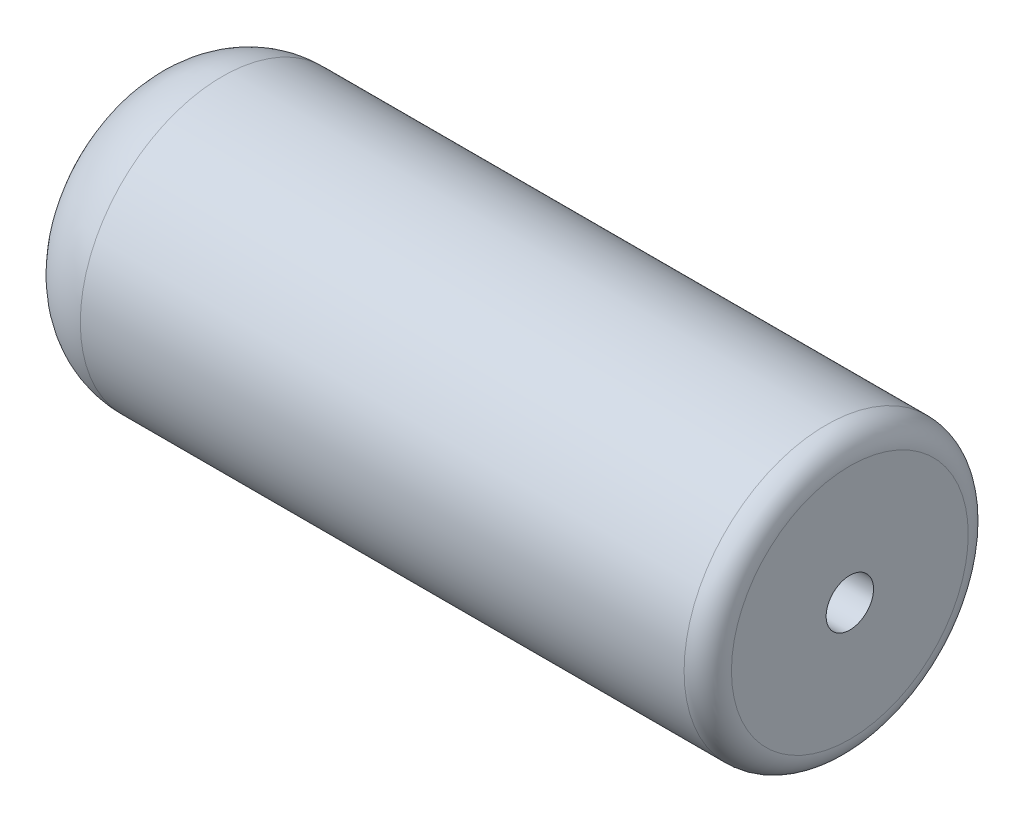
ISO-10303-21;
HEADER;
FILE_DESCRIPTION(('STEP AP214'),'2;1');
FILE_NAME('part.step','',(''),(''),'','','');
FILE_SCHEMA(('AUTOMOTIVE_DESIGN { 1 0 10303 214 1 1 1 1 }'));
ENDSEC;
DATA;
#1=APPLICATION_CONTEXT('core data for automotive mechanical design processes');
#2=APPLICATION_PROTOCOL_DEFINITION('international standard','automotive_design',2000,#1);
#3=PRODUCT_CONTEXT('',#1,'mechanical');
#4=PRODUCT('Part','Part','',(#3));
#5=PRODUCT_RELATED_PRODUCT_CATEGORY('part','',(#4));
#6=PRODUCT_DEFINITION_FORMATION('','',#4);
#7=PRODUCT_DEFINITION_CONTEXT('part definition',#1,'design');
#8=PRODUCT_DEFINITION('design','',#6,#7);
#9=PRODUCT_DEFINITION_SHAPE('','',#8);
#10=(LENGTH_UNIT() NAMED_UNIT(*) SI_UNIT(.MILLI.,.METRE.));
#11=(NAMED_UNIT(*) PLANE_ANGLE_UNIT() SI_UNIT($,.RADIAN.));
#12=(NAMED_UNIT(*) SI_UNIT($,.STERADIAN.) SOLID_ANGLE_UNIT());
#13=UNCERTAINTY_MEASURE_WITH_UNIT(LENGTH_MEASURE(1.E-05),#10,'distance_accuracy_value','');
#14=(GEOMETRIC_REPRESENTATION_CONTEXT(3) GLOBAL_UNCERTAINTY_ASSIGNED_CONTEXT((#13)) GLOBAL_UNIT_ASSIGNED_CONTEXT((#10,
#11,#12)) REPRESENTATION_CONTEXT('',''));
#15=CARTESIAN_POINT('',(0.,0.,0.));
#16=DIRECTION('',(0.,0.,1.));
#17=DIRECTION('',(1.,0.,0.));
#18=AXIS2_PLACEMENT_3D('',#15,#16,#17);
#19=CARTESIAN_POINT('',(76.2,0.,0.));
#20=DIRECTION('',(-1.,0.,0.));
#21=DIRECTION('',(0.,0.,1.));
#22=AXIS2_PLACEMENT_3D('',#19,#20,#21);
#23=CYLINDRICAL_SURFACE('',#22,15.24);
#24=CARTESIAN_POINT('',(73.66,0.,0.));
#25=DIRECTION('',(1.,0.,0.));
#26=DIRECTION('',(0.,0.,-1.));
#27=AXIS2_PLACEMENT_3D('',#24,#25,#26);
#28=CIRCLE('',#27,15.24);
#29=CARTESIAN_POINT('',(73.66,0.,15.24));
#30=VERTEX_POINT('',#29);
#31=EDGE_CURVE('E10',#30,#30,#28,.F.);
#32=CARTESIAN_POINT('',(8.88999999999995,0.,0.));
#33=DIRECTION('',(1.,0.,0.));
#34=DIRECTION('',(0.,0.,-1.));
#35=AXIS2_PLACEMENT_3D('',#32,#33,#34);
#36=CIRCLE('',#35,15.24);
#37=CARTESIAN_POINT('',(8.88999999999995,0.,15.24));
#38=VERTEX_POINT('',#37);
#39=EDGE_CURVE('E55',#38,#38,#36,.T.);
#40=CARTESIAN_POINT('',(73.66,0.,15.24));
#41=CARTESIAN_POINT('',(72.9853125,0.,15.24));
#42=CARTESIAN_POINT('',(72.310625,0.,15.24));
#43=CARTESIAN_POINT('',(70.96125,0.,15.24));
#44=CARTESIAN_POINT('',(70.2865625,0.,15.24));
#45=CARTESIAN_POINT('',(68.9371875,0.,15.24));
#46=CARTESIAN_POINT('',(68.2625,0.,15.24));
#47=CARTESIAN_POINT('',(66.913125,0.,15.24));
#48=CARTESIAN_POINT('',(66.2384375,0.,15.24));
#49=CARTESIAN_POINT('',(64.8890625,0.,15.24));
#50=CARTESIAN_POINT('',(64.214375,0.,15.24));
#51=CARTESIAN_POINT('',(62.865,0.,15.24));
#52=CARTESIAN_POINT('',(62.1903125,0.,15.24));
#53=CARTESIAN_POINT('',(60.8409375,0.,15.24));
#54=CARTESIAN_POINT('',(60.16625,0.,15.24));
#55=CARTESIAN_POINT('',(58.816875,0.,15.24));
#56=CARTESIAN_POINT('',(58.1421875,0.,15.24));
#57=CARTESIAN_POINT('',(56.7928125,0.,15.24));
#58=CARTESIAN_POINT('',(56.118125,0.,15.24));
#59=CARTESIAN_POINT('',(54.76875,0.,15.24));
#60=CARTESIAN_POINT('',(54.0940625,0.,15.24));
#61=CARTESIAN_POINT('',(52.7446875,0.,15.24));
#62=CARTESIAN_POINT('',(52.07,0.,15.24));
#63=CARTESIAN_POINT('',(50.720625,0.,15.24));
#64=CARTESIAN_POINT('',(50.0459375,0.,15.24));
#65=CARTESIAN_POINT('',(48.6965625,0.,15.24));
#66=CARTESIAN_POINT('',(48.021875,0.,15.24));
#67=CARTESIAN_POINT('',(46.6725,0.,15.24));
#68=CARTESIAN_POINT('',(45.9978125,0.,15.24));
#69=CARTESIAN_POINT('',(44.6484375,0.,15.24));
#70=CARTESIAN_POINT('',(43.97375,0.,15.24));
#71=CARTESIAN_POINT('',(42.624375,0.,15.24));
#72=CARTESIAN_POINT('',(41.9496875,0.,15.24));
#73=CARTESIAN_POINT('',(40.6003125,0.,15.24));
#74=CARTESIAN_POINT('',(39.925625,0.,15.24));
#75=CARTESIAN_POINT('',(38.57625,0.,15.24));
#76=CARTESIAN_POINT('',(37.9015625,0.,15.24));
#77=CARTESIAN_POINT('',(36.5521875,0.,15.24));
#78=CARTESIAN_POINT('',(35.8775,0.,15.24));
#79=CARTESIAN_POINT('',(34.528125,0.,15.24));
#80=CARTESIAN_POINT('',(33.8534375,0.,15.24));
#81=CARTESIAN_POINT('',(32.5040625,0.,15.24));
#82=CARTESIAN_POINT('',(31.829375,0.,15.24));
#83=CARTESIAN_POINT('',(30.48,0.,15.24));
#84=CARTESIAN_POINT('',(29.8053125,0.,15.24));
#85=CARTESIAN_POINT('',(28.4559375,0.,15.24));
#86=CARTESIAN_POINT('',(27.78125,0.,15.24));
#87=CARTESIAN_POINT('',(26.431875,0.,15.24));
#88=CARTESIAN_POINT('',(25.7571875,0.,15.24));
#89=CARTESIAN_POINT('',(24.4078125,0.,15.24));
#90=CARTESIAN_POINT('',(23.733125,0.,15.24));
#91=CARTESIAN_POINT('',(22.38375,0.,15.24));
#92=CARTESIAN_POINT('',(21.7090625,0.,15.24));
#93=CARTESIAN_POINT('',(20.3596875,0.,15.24));
#94=CARTESIAN_POINT('',(19.685,0.,15.24));
#95=CARTESIAN_POINT('',(18.335625,0.,15.24));
#96=CARTESIAN_POINT('',(17.6609375,0.,15.24));
#97=CARTESIAN_POINT('',(16.3115625,0.,15.24));
#98=CARTESIAN_POINT('',(15.636875,0.,15.24));
#99=CARTESIAN_POINT('',(14.2875,0.,15.24));
#100=CARTESIAN_POINT('',(13.6128125,0.,15.24));
#101=CARTESIAN_POINT('',(12.2634375,0.,15.24));
#102=CARTESIAN_POINT('',(11.58875,0.,15.24));
#103=CARTESIAN_POINT('',(10.239375,0.,15.24));
#104=CARTESIAN_POINT('',(9.56468749999996,0.,15.24));
#105=CARTESIAN_POINT('',(8.88999999999995,0.,15.24));
#106=B_SPLINE_CURVE_WITH_KNOTS('',3,(#40,#41,#42,#43,#44,#45,#46,#47,#48,#49,#50,#51,#52,#53,
#54,#55,#56,#57,#58,#59,#60,#61,#62,#63,#64,#65,#66,#67,#68,#69,#70,#71,#72,#73,#74,#75,#76,#77,
#78,#79,#80,#81,#82,#83,#84,#85,#86,#87,#88,#89,#90,#91,#92,#93,#94,#95,#96,#97,#98,#99,#100,
#101,#102,#103,#104,#105),.UNSPECIFIED.,.F.,.F.,(4,2,2,2,2,2,2,2,2,2,2,2,2,2,2,2,2,2,2,2,2,2,2,
2,2,2,2,2,2,2,2,2,4),(0.,2.02406249999999,4.048125,6.07218749999999,8.09625,10.1203125,
12.144375,14.1684375,16.1925,18.2165625,20.240625,22.2646875,24.28875,26.3128125,28.336875,
30.3609375,32.385,34.4090625,36.433125,38.4571875,40.48125,42.5053125,44.529375,46.5534375,
48.5775,50.6015625,52.625625,54.6496875,56.67375,58.6978125,60.721875,62.7459375,64.77),.UNSPECIFIED.);
#107=EDGE_CURVE('BSEAM37',#30,#38,#106,.T.);
#108=ORIENTED_EDGE('',*,*,#31,.T.);
#109=ORIENTED_EDGE('',*,*,#39,.T.);
#110=ORIENTED_EDGE('',*,*,#107,.T.);
#111=ORIENTED_EDGE('',*,*,#107,.F.);
#112=EDGE_LOOP('',(#108,#110,#109,#111));
#113=FACE_BOUND('',#112,.T.);
#114=ADVANCED_FACE('F37',(#113),#23,.T.);
#115=CARTESIAN_POINT('',(76.2,0.,0.));
#116=DIRECTION('',(1.,0.,0.));
#117=DIRECTION('',(0.,0.,-1.));
#118=AXIS2_PLACEMENT_3D('',#115,#116,#117);
#119=PLANE('',#118);
#120=CARTESIAN_POINT('',(76.2,0.,0.));
#121=DIRECTION('',(1.,0.,0.));
#122=DIRECTION('',(0.,0.,-1.));
#123=AXIS2_PLACEMENT_3D('',#120,#121,#122);
#124=CIRCLE('',#123,12.7);
#125=CARTESIAN_POINT('',(76.2,0.,-12.7));
#126=VERTEX_POINT('',#125);
#127=EDGE_CURVE('E45',#126,#126,#124,.T.);
#128=ORIENTED_EDGE('',*,*,#127,.T.);
#129=EDGE_LOOP('',(#128));
#130=FACE_BOUND('',#129,.T.);
#131=CARTESIAN_POINT('',(76.2,0.,0.));
#132=DIRECTION('',(1.,0.,0.));
#133=DIRECTION('',(0.,0.,-1.));
#134=AXIS2_PLACEMENT_3D('',#131,#132,#133);
#135=CIRCLE('',#134,2.54);
#136=CARTESIAN_POINT('',(76.2,0.,-2.54));
#137=VERTEX_POINT('',#136);
#138=EDGE_CURVE('E62',#137,#137,#135,.T.);
#139=ORIENTED_EDGE('',*,*,#138,.F.);
#140=EDGE_LOOP('',(#139));
#141=FACE_BOUND('',#140,.T.);
#142=ADVANCED_FACE('F79',(#130,#141),#119,.T.);
#143=CARTESIAN_POINT('',(0.,0.,0.));
#144=DIRECTION('',(1.,0.,0.));
#145=DIRECTION('',(0.,0.,-1.));
#146=AXIS2_PLACEMENT_3D('',#143,#144,#145);
#147=PLANE('',#146);
#148=CARTESIAN_POINT('',(0.,0.,0.));
#149=DIRECTION('',(1.,0.,0.));
#150=DIRECTION('',(0.,0.,-1.));
#151=AXIS2_PLACEMENT_3D('',#148,#149,#150);
#152=CIRCLE('',#151,6.35);
#153=CARTESIAN_POINT('',(0.,0.,-6.35));
#154=VERTEX_POINT('',#153);
#155=EDGE_CURVE('E50',#154,#154,#152,.F.);
#156=ORIENTED_EDGE('',*,*,#155,.T.);
#157=EDGE_LOOP('',(#156));
#158=FACE_BOUND('',#157,.T.);
#159=ADVANCED_FACE('F75',(#158),#147,.F.);
#160=CARTESIAN_POINT('',(12.7,0.,0.));
#161=DIRECTION('',(1.,0.,0.));
#162=DIRECTION('',(0.,0.,-1.));
#163=AXIS2_PLACEMENT_3D('',#160,#161,#162);
#164=CYLINDRICAL_SURFACE('',#163,2.54);
#165=CARTESIAN_POINT('',(12.7,0.,0.));
#166=DIRECTION('',(1.,0.,0.));
#167=DIRECTION('',(0.,0.,-1.));
#168=AXIS2_PLACEMENT_3D('',#165,#166,#167);
#169=CIRCLE('',#168,2.54);
#170=CARTESIAN_POINT('',(12.7,0.,-2.54));
#171=VERTEX_POINT('',#170);
#172=EDGE_CURVE('E61',#171,#171,#169,.T.);
#173=ORIENTED_EDGE('',*,*,#172,.F.);
#174=EDGE_LOOP('',(#173));
#175=FACE_BOUND('',#174,.T.);
#176=ORIENTED_EDGE('',*,*,#138,.T.);
#177=EDGE_LOOP('',(#176));
#178=FACE_BOUND('',#177,.T.);
#179=ADVANCED_FACE('F72',(#175,#178),#164,.F.);
#180=CARTESIAN_POINT('',(12.7,0.,0.));
#181=DIRECTION('',(1.,0.,0.));
#182=DIRECTION('',(0.,0.,-1.));
#183=AXIS2_PLACEMENT_3D('',#180,#181,#182);
#184=PLANE('',#183);
#185=ORIENTED_EDGE('',*,*,#172,.T.);
#186=EDGE_LOOP('',(#185));
#187=FACE_BOUND('',#186,.T.);
#188=ADVANCED_FACE('F70',(#187),#184,.T.);
#189=CARTESIAN_POINT('',(8.89,0.,0.));
#190=DIRECTION('',(1.,0.,0.));
#191=DIRECTION('',(0.,0.,-1.));
#192=AXIS2_PLACEMENT_3D('',#189,#190,#191);
#193=DEGENERATE_TOROIDAL_SURFACE('',#192,6.35,8.89,.T.);
#194=ORIENTED_EDGE('',*,*,#155,.F.);
#195=EDGE_LOOP('',(#194));
#196=FACE_BOUND('',#195,.T.);
#197=ORIENTED_EDGE('',*,*,#39,.F.);
#198=EDGE_LOOP('',(#197));
#199=FACE_BOUND('',#198,.T.);
#200=ADVANCED_FACE('F90',(#196,#199),#193,.T.);
#201=CARTESIAN_POINT('',(73.66,0.,0.));
#202=DIRECTION('',(1.,0.,0.));
#203=DIRECTION('',(0.,0.,-1.));
#204=AXIS2_PLACEMENT_3D('',#201,#202,#203);
#205=TOROIDAL_SURFACE('',#204,12.7,2.54);
#206=ORIENTED_EDGE('',*,*,#31,.F.);
#207=EDGE_LOOP('',(#206));
#208=FACE_BOUND('',#207,.T.);
#209=ORIENTED_EDGE('',*,*,#127,.F.);
#210=EDGE_LOOP('',(#209));
#211=FACE_BOUND('',#210,.T.);
#212=ADVANCED_FACE('F39',(#208,#211),#205,.T.);
#213=CLOSED_SHELL('',(#114,#142,#159,#179,#188,#200,#212));
#214=MANIFOLD_SOLID_BREP('B2',#213);
#215=ADVANCED_BREP_SHAPE_REPRESENTATION('',(#18,#214),#14);
#216=SHAPE_DEFINITION_REPRESENTATION(#9,#215);
ENDSEC;
END-ISO-10303-21;
